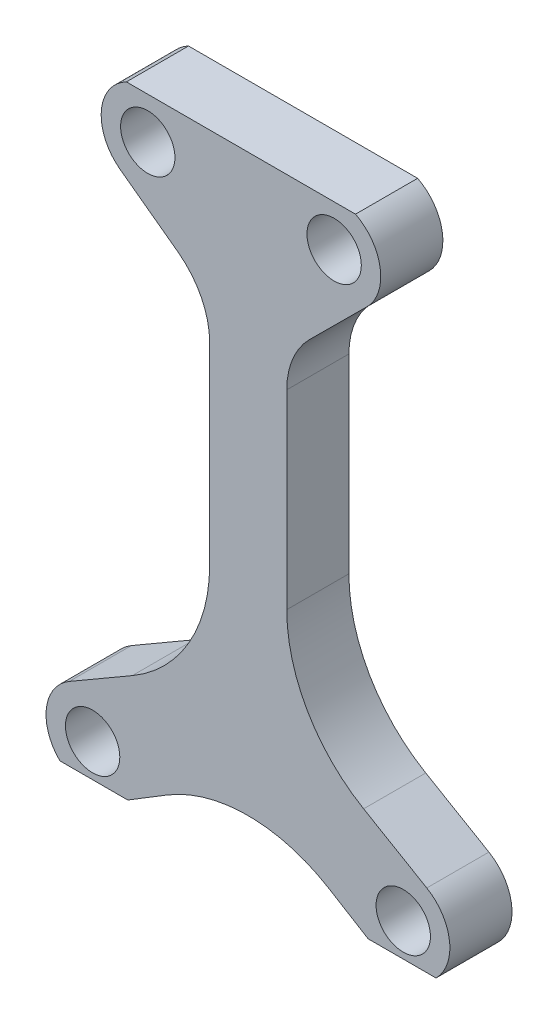
ISO-10303-21;
HEADER;
FILE_DESCRIPTION(('STEP AP214'),'2;1');
FILE_NAME('part.step','',(''),(''),'','','');
FILE_SCHEMA(('AUTOMOTIVE_DESIGN { 1 0 10303 214 1 1 1 1 }'));
ENDSEC;
DATA;
#1=APPLICATION_CONTEXT('core data for automotive mechanical design processes');
#2=APPLICATION_PROTOCOL_DEFINITION('international standard','automotive_design',2000,#1);
#3=PRODUCT_CONTEXT('',#1,'mechanical');
#4=PRODUCT('Part','Part','',(#3));
#5=PRODUCT_RELATED_PRODUCT_CATEGORY('part','',(#4));
#6=PRODUCT_DEFINITION_FORMATION('','',#4);
#7=PRODUCT_DEFINITION_CONTEXT('part definition',#1,'design');
#8=PRODUCT_DEFINITION('design','',#6,#7);
#9=PRODUCT_DEFINITION_SHAPE('','',#8);
#10=(LENGTH_UNIT() NAMED_UNIT(*) SI_UNIT(.MILLI.,.METRE.));
#11=(NAMED_UNIT(*) PLANE_ANGLE_UNIT() SI_UNIT($,.RADIAN.));
#12=(NAMED_UNIT(*) SI_UNIT($,.STERADIAN.) SOLID_ANGLE_UNIT());
#13=UNCERTAINTY_MEASURE_WITH_UNIT(LENGTH_MEASURE(1.E-05),#10,'distance_accuracy_value','');
#14=(GEOMETRIC_REPRESENTATION_CONTEXT(3) GLOBAL_UNCERTAINTY_ASSIGNED_CONTEXT((#13)) GLOBAL_UNIT_ASSIGNED_CONTEXT((#10,
#11,#12)) REPRESENTATION_CONTEXT('',''));
#15=CARTESIAN_POINT('',(0.,0.,0.));
#16=DIRECTION('',(0.,0.,1.));
#17=DIRECTION('',(1.,0.,0.));
#18=AXIS2_PLACEMENT_3D('',#15,#16,#17);
#19=CARTESIAN_POINT('',(0.,0.,4.));
#20=DIRECTION('',(0.,1.,0.));
#21=DIRECTION('',(0.,0.,1.));
#22=AXIS2_PLACEMENT_3D('',#19,#20,#21);
#23=PLANE('',#22);
#24=DIRECTION('',(0.,0.,1.));
#25=VECTOR('',#24,1.);
#26=CARTESIAN_POINT('',(26.1079954434977,0.,0.));
#27=LINE('',#26,#25);
#28=CARTESIAN_POINT('',(26.1079954434977,0.,4.));
#29=VERTEX_POINT('',#28);
#30=CARTESIAN_POINT('',(26.1079954434977,0.,0.));
#31=VERTEX_POINT('',#30);
#32=EDGE_CURVE('E363',#29,#31,#27,.F.);
#33=ORIENTED_EDGE('',*,*,#32,.F.);
#34=DIRECTION('',(1.,0.,0.));
#35=VECTOR('',#34,1.);
#36=CARTESIAN_POINT('',(0.,0.,4.));
#37=LINE('',#36,#35);
#38=CARTESIAN_POINT('',(21.7389056072508,0.,4.));
#39=VERTEX_POINT('',#38);
#40=EDGE_CURVE('E398',#39,#29,#37,.T.);
#41=ORIENTED_EDGE('',*,*,#40,.F.);
#42=DIRECTION('',(0.,0.,1.));
#43=VECTOR('',#42,1.);
#44=CARTESIAN_POINT('',(21.7389056072508,0.,4.));
#45=LINE('',#44,#43);
#46=CARTESIAN_POINT('',(21.7389056072508,0.,0.));
#47=VERTEX_POINT('',#46);
#48=EDGE_CURVE('E360',#47,#39,#45,.T.);
#49=ORIENTED_EDGE('',*,*,#48,.F.);
#50=DIRECTION('',(1.,0.,0.));
#51=VECTOR('',#50,1.);
#52=CARTESIAN_POINT('',(0.,0.,0.));
#53=LINE('',#52,#51);
#54=EDGE_CURVE('E370',#47,#31,#53,.T.);
#55=ORIENTED_EDGE('',*,*,#54,.T.);
#56=EDGE_LOOP('',(#33,#41,#49,#55));
#57=FACE_BOUND('',#56,.T.);
#58=ADVANCED_FACE('F38',(#57),#23,.F.);
#59=DIRECTION('',(0.,0.,-1.));
#60=VECTOR('',#59,1.);
#61=CARTESIAN_POINT('',(6.26109439275633,0.,4.));
#62=LINE('',#61,#60);
#63=CARTESIAN_POINT('',(6.26109439275633,0.,4.));
#64=VERTEX_POINT('',#63);
#65=CARTESIAN_POINT('',(6.26109439275633,0.,0.));
#66=VERTEX_POINT('',#65);
#67=EDGE_CURVE('E61',#64,#66,#62,.T.);
#68=ORIENTED_EDGE('',*,*,#67,.F.);
#69=CARTESIAN_POINT('',(1.89200455651023,0.,4.));
#70=VERTEX_POINT('',#69);
#71=EDGE_CURVE('E402',#70,#64,#37,.T.);
#72=ORIENTED_EDGE('',*,*,#71,.F.);
#73=DIRECTION('',(0.,0.,1.));
#74=VECTOR('',#73,1.);
#75=CARTESIAN_POINT('',(1.89200455651023,0.,0.));
#76=LINE('',#75,#74);
#77=CARTESIAN_POINT('',(1.89200455651023,0.,0.));
#78=VERTEX_POINT('',#77);
#79=EDGE_CURVE('E355',#78,#70,#76,.T.);
#80=ORIENTED_EDGE('',*,*,#79,.F.);
#81=EDGE_CURVE('E412',#78,#66,#53,.T.);
#82=ORIENTED_EDGE('',*,*,#81,.T.);
#83=EDGE_LOOP('',(#68,#72,#80,#82));
#84=FACE_BOUND('',#83,.T.);
#85=ADVANCED_FACE('F463',(#84),#23,.F.);
#86=CARTESIAN_POINT('',(0.,40.,4.));
#87=DIRECTION('',(0.,-1.,0.));
#88=DIRECTION('',(0.,0.,-1.));
#89=AXIS2_PLACEMENT_3D('',#86,#87,#88);
#90=PLANE('',#89);
#91=DIRECTION('',(0.,0.,1.));
#92=VECTOR('',#91,1.);
#93=CARTESIAN_POINT('',(6.17324998088211,40.,0.));
#94=LINE('',#93,#92);
#95=CARTESIAN_POINT('',(6.17324998088211,40.,4.));
#96=VERTEX_POINT('',#95);
#97=CARTESIAN_POINT('',(6.17324998088211,40.,0.));
#98=VERTEX_POINT('',#97);
#99=EDGE_CURVE('E352',#96,#98,#94,.F.);
#100=ORIENTED_EDGE('',*,*,#99,.F.);
#101=DIRECTION('',(-1.,0.,0.));
#102=VECTOR('',#101,1.);
#103=CARTESIAN_POINT('',(0.,40.,4.));
#104=LINE('',#103,#102);
#105=CARTESIAN_POINT('',(20.9267500191273,40.,4.));
#106=VERTEX_POINT('',#105);
#107=EDGE_CURVE('E404',#106,#96,#104,.T.);
#108=ORIENTED_EDGE('',*,*,#107,.F.);
#109=DIRECTION('',(0.,0.,1.));
#110=VECTOR('',#109,1.);
#111=CARTESIAN_POINT('',(20.9267500191273,40.,0.));
#112=LINE('',#111,#110);
#113=CARTESIAN_POINT('',(20.9267500191273,40.,0.));
#114=VERTEX_POINT('',#113);
#115=EDGE_CURVE('E316',#114,#106,#112,.T.);
#116=ORIENTED_EDGE('',*,*,#115,.F.);
#117=DIRECTION('',(-1.,0.,0.));
#118=VECTOR('',#117,1.);
#119=CARTESIAN_POINT('',(0.,40.,0.));
#120=LINE('',#119,#118);
#121=EDGE_CURVE('E403',#114,#98,#120,.T.);
#122=ORIENTED_EDGE('',*,*,#121,.T.);
#123=EDGE_LOOP('',(#100,#108,#116,#122));
#124=FACE_BOUND('',#123,.T.);
#125=ADVANCED_FACE('F428',(#124),#90,.F.);
#126=CARTESIAN_POINT('',(0.,0.,4.));
#127=DIRECTION('',(0.,0.,-1.));
#128=DIRECTION('',(-1.,0.,0.));
#129=AXIS2_PLACEMENT_3D('',#126,#127,#128);
#130=PLANE('',#129);
#131=CARTESIAN_POINT('',(24.0000000000039,2.13456206520436,4.));
#132=DIRECTION('',(0.,0.,1.));
#133=DIRECTION('',(1.,0.,0.));
#134=AXIS2_PLACEMENT_3D('',#131,#132,#133);
#135=CIRCLE('',#134,1.75);
#136=CARTESIAN_POINT('',(25.7500000000039,2.13456206520436,4.));
#137=VERTEX_POINT('',#136);
#138=EDGE_CURVE('E387',#137,#137,#135,.T.);
#139=ORIENTED_EDGE('',*,*,#138,.F.);
#140=EDGE_LOOP('',(#139));
#141=FACE_BOUND('',#140,.T.);
#142=CARTESIAN_POINT('',(7.55000000000471,37.3345620650921,4.));
#143=DIRECTION('',(0.,0.,1.));
#144=DIRECTION('',(1.,0.,0.));
#145=AXIS2_PLACEMENT_3D('',#142,#143,#144);
#146=CIRCLE('',#145,1.75);
#147=CARTESIAN_POINT('',(9.30000000000471,37.3345620650921,4.));
#148=VERTEX_POINT('',#147);
#149=EDGE_CURVE('E380',#148,#148,#146,.T.);
#150=ORIENTED_EDGE('',*,*,#149,.F.);
#151=EDGE_LOOP('',(#150));
#152=FACE_BOUND('',#151,.T.);
#153=CARTESIAN_POINT('',(19.5500000000047,37.3345620650921,4.));
#154=DIRECTION('',(0.,0.,1.));
#155=DIRECTION('',(1.,0.,0.));
#156=AXIS2_PLACEMENT_3D('',#153,#154,#155);
#157=CIRCLE('',#156,1.75);
#158=CARTESIAN_POINT('',(21.3000000000047,37.3345620650921,4.));
#159=VERTEX_POINT('',#158);
#160=EDGE_CURVE('E365',#159,#159,#157,.T.);
#161=ORIENTED_EDGE('',*,*,#160,.F.);
#162=EDGE_LOOP('',(#161));
#163=FACE_BOUND('',#162,.T.);
#164=CARTESIAN_POINT('',(4.00000000000394,2.13456206520442,4.));
#165=DIRECTION('',(0.,0.,1.));
#166=DIRECTION('',(1.,0.,0.));
#167=AXIS2_PLACEMENT_3D('',#164,#165,#166);
#168=CIRCLE('',#167,1.75);
#169=CARTESIAN_POINT('',(5.75000000000394,2.13456206520442,4.));
#170=VERTEX_POINT('',#169);
#171=EDGE_CURVE('E371',#170,#170,#168,.T.);
#172=ORIENTED_EDGE('',*,*,#171,.F.);
#173=EDGE_LOOP('',(#172));
#174=FACE_BOUND('',#173,.T.);
#175=DIRECTION('',(0.853556600559129,-0.521000124416438,0.));
#176=VECTOR('',#175,1.);
#177=CARTESIAN_POINT('',(19.2100012441668,1.54361115237226,4.));
#178=LINE('',#177,#176);
#179=CARTESIAN_POINT('',(19.2100012441668,1.54361115237226,4.));
#180=VERTEX_POINT('',#179);
#181=EDGE_CURVE('E309',#180,#39,#178,.T.);
#182=ORIENTED_EDGE('',*,*,#181,.T.);
#183=ORIENTED_EDGE('',*,*,#40,.T.);
#184=CARTESIAN_POINT('',(24.0000000000039,2.13456206520436,4.));
#185=DIRECTION('',(0.,0.,1.));
#186=DIRECTION('',(1.,0.,0.));
#187=AXIS2_PLACEMENT_3D('',#184,#185,#186);
#188=CIRCLE('',#187,3.);
#189=CARTESIAN_POINT('',(25.51532512477,4.72372984004107,4.));
#190=VERTEX_POINT('',#189);
#191=EDGE_CURVE('E248',#29,#190,#188,.T.);
#192=ORIENTED_EDGE('',*,*,#191,.T.);
#193=DIRECTION('',(-0.863055924945569,0.505108374922004,0.));
#194=VECTOR('',#193,1.);
#195=CARTESIAN_POINT('',(21.44891625078,7.1036186963038,4.));
#196=LINE('',#195,#194);
#197=CARTESIAN_POINT('',(21.44891625078,7.10361869630379,4.));
#198=VERTEX_POINT('',#197);
#199=EDGE_CURVE('E252',#190,#198,#196,.T.);
#200=ORIENTED_EDGE('',*,*,#199,.T.);
#201=CARTESIAN_POINT('',(26.5,15.7341779457595,4.));
#202=DIRECTION('',(0.,0.,-1.));
#203=DIRECTION('',(-1.,0.,0.));
#204=AXIS2_PLACEMENT_3D('',#201,#202,#203);
#205=CIRCLE('',#204,10.);
#206=CARTESIAN_POINT('',(16.5,15.7341779457596,4.));
#207=VERTEX_POINT('',#206);
#208=EDGE_CURVE('E256',#198,#207,#205,.T.);
#209=ORIENTED_EDGE('',*,*,#208,.T.);
#210=DIRECTION('',(0.,1.,0.));
#211=VECTOR('',#210,1.);
#212=CARTESIAN_POINT('',(16.5,27.9926692747528,4.));
#213=LINE('',#212,#211);
#214=CARTESIAN_POINT('',(16.5,27.9926692747528,4.));
#215=VERTEX_POINT('',#214);
#216=EDGE_CURVE('E182',#207,#215,#213,.T.);
#217=ORIENTED_EDGE('',*,*,#216,.T.);
#218=CARTESIAN_POINT('',(21.5,27.9926692747528,4.));
#219=DIRECTION('',(0.,0.,-1.));
#220=DIRECTION('',(1.,0.,0.));
#221=AXIS2_PLACEMENT_3D('',#218,#219,#220);
#222=CIRCLE('',#221,5.);
#223=CARTESIAN_POINT('',(17.9749396182113,31.5386457699856,4.));
#224=VERTEX_POINT('',#223);
#225=EDGE_CURVE('E261',#215,#224,#222,.T.);
#226=ORIENTED_EDGE('',*,*,#225,.T.);
#227=DIRECTION('',(0.709195299046571,0.705012076357735,0.));
#228=VECTOR('',#227,1.);
#229=CARTESIAN_POINT('',(17.9749396182113,31.5386457699856,4.));
#230=LINE('',#229,#228);
#231=CARTESIAN_POINT('',(21.6650362290779,35.2069761679524,4.));
#232=VERTEX_POINT('',#231);
#233=EDGE_CURVE('E265',#224,#232,#230,.T.);
#234=ORIENTED_EDGE('',*,*,#233,.T.);
#235=CARTESIAN_POINT('',(19.5500000000047,37.3345620650921,4.));
#236=DIRECTION('',(0.,0.,1.));
#237=DIRECTION('',(1.,0.,0.));
#238=AXIS2_PLACEMENT_3D('',#235,#236,#237);
#239=CIRCLE('',#238,3.);
#240=EDGE_CURVE('E269',#232,#106,#239,.T.);
#241=ORIENTED_EDGE('',*,*,#240,.T.);
#242=ORIENTED_EDGE('',*,*,#107,.T.);
#243=CARTESIAN_POINT('',(7.55000000000471,37.3345620650921,4.));
#244=DIRECTION('',(0.,0.,1.));
#245=DIRECTION('',(1.,0.,0.));
#246=AXIS2_PLACEMENT_3D('',#243,#244,#245);
#247=CIRCLE('',#246,3.);
#248=CARTESIAN_POINT('',(5.77076355040617,34.919128841751,4.));
#249=VERTEX_POINT('',#248);
#250=EDGE_CURVE('E273',#96,#249,#247,.T.);
#251=ORIENTED_EDGE('',*,*,#250,.T.);
#252=DIRECTION('',(0.805144407780368,-0.593078816532846,0.));
#253=VECTOR('',#252,1.);
#254=CARTESIAN_POINT('',(5.77076355040617,34.919128841751,4.));
#255=LINE('',#254,#253);
#256=CARTESIAN_POINT('',(9.50151194166027,32.1710158085045,4.));
#257=VERTEX_POINT('',#256);
#258=EDGE_CURVE('E277',#249,#257,#255,.T.);
#259=ORIENTED_EDGE('',*,*,#258,.T.);
#260=CARTESIAN_POINT('',(6.53611785899604,28.1452937696026,4.));
#261=DIRECTION('',(0.,0.,-1.));
#262=DIRECTION('',(1.,0.,0.));
#263=AXIS2_PLACEMENT_3D('',#260,#261,#262);
#264=CIRCLE('',#263,5.);
#265=CARTESIAN_POINT('',(11.536117858996,28.1452937696026,4.));
#266=VERTEX_POINT('',#265);
#267=EDGE_CURVE('E281',#257,#266,#264,.T.);
#268=ORIENTED_EDGE('',*,*,#267,.T.);
#269=DIRECTION('',(0.,-1.,0.));
#270=VECTOR('',#269,1.);
#271=CARTESIAN_POINT('',(11.536117858996,28.1452937696026,4.));
#272=LINE('',#271,#270);
#273=CARTESIAN_POINT('',(11.536117858996,15.7341925211431,4.));
#274=VERTEX_POINT('',#273);
#275=EDGE_CURVE('E285',#266,#274,#272,.T.);
#276=ORIENTED_EDGE('',*,*,#275,.T.);
#277=CARTESIAN_POINT('',(1.53611785899604,15.7341925211431,4.));
#278=DIRECTION('',(0.,0.,-1.));
#279=DIRECTION('',(-1.,0.,0.));
#280=AXIS2_PLACEMENT_3D('',#277,#278,#279);
#281=CIRCLE('',#280,10.);
#282=CARTESIAN_POINT('',(6.55381263069558,7.08417869583285,4.));
#283=VERTEX_POINT('',#282);
#284=EDGE_CURVE('E289',#274,#283,#281,.T.);
#285=ORIENTED_EDGE('',*,*,#284,.T.);
#286=DIRECTION('',(-0.865001382531029,-0.501769477169953,0.));
#287=VECTOR('',#286,1.);
#288=CARTESIAN_POINT('',(6.55381263069558,7.08417869583285,4.));
#289=LINE('',#288,#287);
#290=CARTESIAN_POINT('',(2.49469156849407,4.72956621279751,4.));
#291=VERTEX_POINT('',#290);
#292=EDGE_CURVE('E293',#283,#291,#289,.T.);
#293=ORIENTED_EDGE('',*,*,#292,.T.);
#294=CARTESIAN_POINT('',(4.00000000000394,2.13456206520442,4.));
#295=DIRECTION('',(0.,0.,1.));
#296=DIRECTION('',(1.,0.,0.));
#297=AXIS2_PLACEMENT_3D('',#294,#295,#296);
#298=CIRCLE('',#297,3.);
#299=EDGE_CURVE('E297',#291,#70,#298,.T.);
#300=ORIENTED_EDGE('',*,*,#299,.T.);
#301=ORIENTED_EDGE('',*,*,#71,.T.);
#302=DIRECTION('',(0.853556600558915,0.521000124416788,0.));
#303=VECTOR('',#302,1.);
#304=CARTESIAN_POINT('',(5.5630003732543,-0.426107736472325,4.));
#305=LINE('',#304,#303);
#306=CARTESIAN_POINT('',(8.78999875583448,1.54361115237013,4.));
#307=VERTEX_POINT('',#306);
#308=EDGE_CURVE('E301',#64,#307,#305,.T.);
#309=ORIENTED_EDGE('',*,*,#308,.T.);
#310=CARTESIAN_POINT('',(14.0000000000024,-6.991954853219,4.));
#311=DIRECTION('',(0.,0.,-1.));
#312=DIRECTION('',(-1.,0.,0.));
#313=AXIS2_PLACEMENT_3D('',#310,#311,#312);
#314=CIRCLE('',#313,10.);
#315=EDGE_CURVE('E305',#307,#180,#314,.T.);
#316=ORIENTED_EDGE('',*,*,#315,.T.);
#317=EDGE_LOOP('',(#182,#183,#192,#200,#209,#217,#226,#234,#241,#242,#251,#259,#268,#276,#285,
#293,#300,#301,#309,#316));
#318=FACE_BOUND('',#317,.T.);
#319=ADVANCED_FACE('F434',(#141,#152,#163,#174,#318),#130,.F.);
#320=CARTESIAN_POINT('',(0.,0.,0.));
#321=DIRECTION('',(0.,0.,-1.));
#322=DIRECTION('',(-1.,0.,0.));
#323=AXIS2_PLACEMENT_3D('',#320,#321,#322);
#324=PLANE('',#323);
#325=CARTESIAN_POINT('',(4.00000000000394,2.13456206520442,0.));
#326=DIRECTION('',(0.,0.,1.));
#327=DIRECTION('',(1.,0.,0.));
#328=AXIS2_PLACEMENT_3D('',#325,#326,#327);
#329=CIRCLE('',#328,1.75);
#330=CARTESIAN_POINT('',(5.75000000000394,2.13456206520442,0.));
#331=VERTEX_POINT('',#330);
#332=EDGE_CURVE('E366',#331,#331,#329,.T.);
#333=ORIENTED_EDGE('',*,*,#332,.T.);
#334=EDGE_LOOP('',(#333));
#335=FACE_BOUND('',#334,.T.);
#336=CARTESIAN_POINT('',(19.5500000000047,37.3345620650921,0.));
#337=DIRECTION('',(0.,0.,1.));
#338=DIRECTION('',(1.,0.,0.));
#339=AXIS2_PLACEMENT_3D('',#336,#337,#338);
#340=CIRCLE('',#339,1.75);
#341=CARTESIAN_POINT('',(21.3000000000047,37.3345620650921,0.));
#342=VERTEX_POINT('',#341);
#343=EDGE_CURVE('E376',#342,#342,#340,.T.);
#344=ORIENTED_EDGE('',*,*,#343,.T.);
#345=EDGE_LOOP('',(#344));
#346=FACE_BOUND('',#345,.T.);
#347=CARTESIAN_POINT('',(7.55000000000471,37.3345620650921,0.));
#348=DIRECTION('',(0.,0.,1.));
#349=DIRECTION('',(1.,0.,0.));
#350=AXIS2_PLACEMENT_3D('',#347,#348,#349);
#351=CIRCLE('',#350,1.75);
#352=CARTESIAN_POINT('',(9.30000000000471,37.3345620650921,0.));
#353=VERTEX_POINT('',#352);
#354=EDGE_CURVE('E391',#353,#353,#351,.T.);
#355=ORIENTED_EDGE('',*,*,#354,.T.);
#356=EDGE_LOOP('',(#355));
#357=FACE_BOUND('',#356,.T.);
#358=CARTESIAN_POINT('',(24.0000000000039,2.13456206520436,0.));
#359=DIRECTION('',(0.,0.,1.));
#360=DIRECTION('',(1.,0.,0.));
#361=AXIS2_PLACEMENT_3D('',#358,#359,#360);
#362=CIRCLE('',#361,1.75);
#363=CARTESIAN_POINT('',(25.7500000000039,2.13456206520436,0.));
#364=VERTEX_POINT('',#363);
#365=EDGE_CURVE('E375',#364,#364,#362,.T.);
#366=ORIENTED_EDGE('',*,*,#365,.T.);
#367=EDGE_LOOP('',(#366));
#368=FACE_BOUND('',#367,.T.);
#369=ORIENTED_EDGE('',*,*,#54,.F.);
#370=DIRECTION('',(0.853556600559129,-0.521000124416438,0.));
#371=VECTOR('',#370,1.);
#372=CARTESIAN_POINT('',(19.2100012441668,1.54361115237226,0.));
#373=LINE('',#372,#371);
#374=CARTESIAN_POINT('',(19.2100012441668,1.54361115237226,0.));
#375=VERTEX_POINT('',#374);
#376=EDGE_CURVE('E245',#375,#47,#373,.T.);
#377=ORIENTED_EDGE('',*,*,#376,.F.);
#378=CARTESIAN_POINT('',(14.0000000000024,-6.991954853219,0.));
#379=DIRECTION('',(0.,0.,-1.));
#380=DIRECTION('',(-1.,0.,0.));
#381=AXIS2_PLACEMENT_3D('',#378,#379,#380);
#382=CIRCLE('',#381,10.);
#383=CARTESIAN_POINT('',(8.78999875583448,1.54361115237013,0.));
#384=VERTEX_POINT('',#383);
#385=EDGE_CURVE('E241',#384,#375,#382,.T.);
#386=ORIENTED_EDGE('',*,*,#385,.F.);
#387=DIRECTION('',(-0.853556600558915,-0.521000124416788,0.));
#388=VECTOR('',#387,1.);
#389=CARTESIAN_POINT('',(1.6995185347669,-2.78432805509664,0.));
#390=LINE('',#389,#388);
#391=EDGE_CURVE('E11',#384,#66,#390,.T.);
#392=ORIENTED_EDGE('',*,*,#391,.T.);
#393=ORIENTED_EDGE('',*,*,#81,.F.);
#394=CARTESIAN_POINT('',(4.00000000000394,2.13456206520442,0.));
#395=DIRECTION('',(0.,0.,1.));
#396=DIRECTION('',(1.,0.,0.));
#397=AXIS2_PLACEMENT_3D('',#394,#395,#396);
#398=CIRCLE('',#397,3.);
#399=CARTESIAN_POINT('',(2.49469156849407,4.72956621279751,0.));
#400=VERTEX_POINT('',#399);
#401=EDGE_CURVE('E238',#400,#78,#398,.T.);
#402=ORIENTED_EDGE('',*,*,#401,.F.);
#403=DIRECTION('',(-0.865001382531029,-0.501769477169953,0.));
#404=VECTOR('',#403,1.);
#405=CARTESIAN_POINT('',(6.55381263069558,7.08417869583285,0.));
#406=LINE('',#405,#404);
#407=CARTESIAN_POINT('',(6.55381263069558,7.08417869583285,0.));
#408=VERTEX_POINT('',#407);
#409=EDGE_CURVE('E234',#408,#400,#406,.T.);
#410=ORIENTED_EDGE('',*,*,#409,.F.);
#411=CARTESIAN_POINT('',(1.53611785899604,15.7341925211431,0.));
#412=DIRECTION('',(0.,0.,-1.));
#413=DIRECTION('',(-1.,0.,0.));
#414=AXIS2_PLACEMENT_3D('',#411,#412,#413);
#415=CIRCLE('',#414,10.);
#416=CARTESIAN_POINT('',(11.536117858996,15.7341925211431,0.));
#417=VERTEX_POINT('',#416);
#418=EDGE_CURVE('E230',#417,#408,#415,.T.);
#419=ORIENTED_EDGE('',*,*,#418,.F.);
#420=DIRECTION('',(0.,-1.,0.));
#421=VECTOR('',#420,1.);
#422=CARTESIAN_POINT('',(11.536117858996,28.1452937696026,0.));
#423=LINE('',#422,#421);
#424=CARTESIAN_POINT('',(11.536117858996,28.1452937696026,0.));
#425=VERTEX_POINT('',#424);
#426=EDGE_CURVE('E226',#425,#417,#423,.T.);
#427=ORIENTED_EDGE('',*,*,#426,.F.);
#428=CARTESIAN_POINT('',(6.53611785899604,28.1452937696026,0.));
#429=DIRECTION('',(0.,0.,-1.));
#430=DIRECTION('',(1.,0.,0.));
#431=AXIS2_PLACEMENT_3D('',#428,#429,#430);
#432=CIRCLE('',#431,5.);
#433=CARTESIAN_POINT('',(9.50151194166027,32.1710158085045,0.));
#434=VERTEX_POINT('',#433);
#435=EDGE_CURVE('E222',#434,#425,#432,.T.);
#436=ORIENTED_EDGE('',*,*,#435,.F.);
#437=DIRECTION('',(0.805144407780368,-0.593078816532846,0.));
#438=VECTOR('',#437,1.);
#439=CARTESIAN_POINT('',(5.77076355040617,34.919128841751,0.));
#440=LINE('',#439,#438);
#441=CARTESIAN_POINT('',(5.77076355040617,34.919128841751,0.));
#442=VERTEX_POINT('',#441);
#443=EDGE_CURVE('E218',#442,#434,#440,.T.);
#444=ORIENTED_EDGE('',*,*,#443,.F.);
#445=CARTESIAN_POINT('',(7.55000000000471,37.3345620650921,0.));
#446=DIRECTION('',(0.,0.,-1.));
#447=DIRECTION('',(-1.,0.,0.));
#448=AXIS2_PLACEMENT_3D('',#445,#446,#447);
#449=CIRCLE('',#448,3.);
#450=EDGE_CURVE('E46',#442,#98,#449,.T.);
#451=ORIENTED_EDGE('',*,*,#450,.T.);
#452=ORIENTED_EDGE('',*,*,#121,.F.);
#453=CARTESIAN_POINT('',(19.5500000000047,37.3345620650921,0.));
#454=DIRECTION('',(0.,0.,1.));
#455=DIRECTION('',(1.,0.,0.));
#456=AXIS2_PLACEMENT_3D('',#453,#454,#455);
#457=CIRCLE('',#456,3.);
#458=CARTESIAN_POINT('',(21.6650362290779,35.2069761679524,0.));
#459=VERTEX_POINT('',#458);
#460=EDGE_CURVE('E215',#459,#114,#457,.T.);
#461=ORIENTED_EDGE('',*,*,#460,.F.);
#462=DIRECTION('',(0.709195299046571,0.705012076357735,0.));
#463=VECTOR('',#462,1.);
#464=CARTESIAN_POINT('',(17.9749396182113,31.5386457699856,0.));
#465=LINE('',#464,#463);
#466=CARTESIAN_POINT('',(17.9749396182113,31.5386457699856,0.));
#467=VERTEX_POINT('',#466);
#468=EDGE_CURVE('E208',#467,#459,#465,.T.);
#469=ORIENTED_EDGE('',*,*,#468,.F.);
#470=CARTESIAN_POINT('',(21.5,27.9926692747528,0.));
#471=DIRECTION('',(0.,0.,-1.));
#472=DIRECTION('',(1.,0.,0.));
#473=AXIS2_PLACEMENT_3D('',#470,#471,#472);
#474=CIRCLE('',#473,5.);
#475=CARTESIAN_POINT('',(16.5,27.9926692747528,0.));
#476=VERTEX_POINT('',#475);
#477=EDGE_CURVE('E202',#476,#467,#474,.T.);
#478=ORIENTED_EDGE('',*,*,#477,.F.);
#479=DIRECTION('',(0.,1.,0.));
#480=VECTOR('',#479,1.);
#481=CARTESIAN_POINT('',(16.5,27.9926692747528,0.));
#482=LINE('',#481,#480);
#483=CARTESIAN_POINT('',(16.5,15.7341779457596,0.));
#484=VERTEX_POINT('',#483);
#485=EDGE_CURVE('E179',#484,#476,#482,.T.);
#486=ORIENTED_EDGE('',*,*,#485,.F.);
#487=CARTESIAN_POINT('',(26.5,15.7341779457595,0.));
#488=DIRECTION('',(0.,0.,-1.));
#489=DIRECTION('',(-1.,0.,0.));
#490=AXIS2_PLACEMENT_3D('',#487,#488,#489);
#491=CIRCLE('',#490,10.);
#492=CARTESIAN_POINT('',(21.44891625078,7.1036186963038,0.));
#493=VERTEX_POINT('',#492);
#494=EDGE_CURVE('E191',#493,#484,#491,.T.);
#495=ORIENTED_EDGE('',*,*,#494,.F.);
#496=DIRECTION('',(-0.863055924945569,0.505108374922004,0.));
#497=VECTOR('',#496,1.);
#498=CARTESIAN_POINT('',(21.44891625078,7.1036186963038,0.));
#499=LINE('',#498,#497);
#500=CARTESIAN_POINT('',(25.51532512477,4.72372984004107,0.));
#501=VERTEX_POINT('',#500);
#502=EDGE_CURVE('E196',#501,#493,#499,.T.);
#503=ORIENTED_EDGE('',*,*,#502,.F.);
#504=CARTESIAN_POINT('',(24.0000000000039,2.13456206520436,0.));
#505=DIRECTION('',(0.,0.,-1.));
#506=DIRECTION('',(-1.,0.,0.));
#507=AXIS2_PLACEMENT_3D('',#504,#505,#506);
#508=CIRCLE('',#507,3.);
#509=EDGE_CURVE('E408',#501,#31,#508,.T.);
#510=ORIENTED_EDGE('',*,*,#509,.T.);
#511=EDGE_LOOP('',(#369,#377,#386,#392,#393,#402,#410,#419,#427,#436,#444,#451,#452,#461,#469,
#478,#486,#495,#503,#510));
#512=FACE_BOUND('',#511,.T.);
#513=ADVANCED_FACE('F199',(#335,#346,#357,#368,#512),#324,.T.);
#514=CARTESIAN_POINT('',(24.0000000000039,2.13456206520436,0.));
#515=DIRECTION('',(0.,0.,1.));
#516=DIRECTION('',(1.,0.,0.));
#517=AXIS2_PLACEMENT_3D('',#514,#515,#516);
#518=CYLINDRICAL_SURFACE('',#517,1.75);
#519=ORIENTED_EDGE('',*,*,#365,.F.);
#520=EDGE_LOOP('',(#519));
#521=FACE_BOUND('',#520,.T.);
#522=ORIENTED_EDGE('',*,*,#138,.T.);
#523=EDGE_LOOP('',(#522));
#524=FACE_BOUND('',#523,.T.);
#525=ADVANCED_FACE('F513',(#521,#524),#518,.F.);
#526=CARTESIAN_POINT('',(7.55000000000471,37.3345620650921,0.));
#527=DIRECTION('',(0.,0.,1.));
#528=DIRECTION('',(1.,0.,0.));
#529=AXIS2_PLACEMENT_3D('',#526,#527,#528);
#530=CYLINDRICAL_SURFACE('',#529,1.75);
#531=ORIENTED_EDGE('',*,*,#354,.F.);
#532=EDGE_LOOP('',(#531));
#533=FACE_BOUND('',#532,.T.);
#534=ORIENTED_EDGE('',*,*,#149,.T.);
#535=EDGE_LOOP('',(#534));
#536=FACE_BOUND('',#535,.T.);
#537=ADVANCED_FACE('F516',(#533,#536),#530,.F.);
#538=CARTESIAN_POINT('',(19.5500000000047,37.3345620650921,0.));
#539=DIRECTION('',(0.,0.,1.));
#540=DIRECTION('',(1.,0.,0.));
#541=AXIS2_PLACEMENT_3D('',#538,#539,#540);
#542=CYLINDRICAL_SURFACE('',#541,1.75);
#543=ORIENTED_EDGE('',*,*,#343,.F.);
#544=EDGE_LOOP('',(#543));
#545=FACE_BOUND('',#544,.T.);
#546=ORIENTED_EDGE('',*,*,#160,.T.);
#547=EDGE_LOOP('',(#546));
#548=FACE_BOUND('',#547,.T.);
#549=ADVANCED_FACE('F519',(#545,#548),#542,.F.);
#550=CARTESIAN_POINT('',(4.00000000000394,2.13456206520442,0.));
#551=DIRECTION('',(0.,0.,1.));
#552=DIRECTION('',(1.,0.,0.));
#553=AXIS2_PLACEMENT_3D('',#550,#551,#552);
#554=CYLINDRICAL_SURFACE('',#553,1.75);
#555=ORIENTED_EDGE('',*,*,#332,.F.);
#556=EDGE_LOOP('',(#555));
#557=FACE_BOUND('',#556,.T.);
#558=ORIENTED_EDGE('',*,*,#171,.T.);
#559=EDGE_LOOP('',(#558));
#560=FACE_BOUND('',#559,.T.);
#561=ADVANCED_FACE('F526',(#557,#560),#554,.F.);
#562=CARTESIAN_POINT('',(21.44891625078,7.1036186963038,0.));
#563=DIRECTION('',(0.505108374922004,0.863055924945569,0.));
#564=DIRECTION('',(-0.863055924945569,0.505108374922004,0.));
#565=AXIS2_PLACEMENT_3D('',#562,#563,#564);
#566=PLANE('',#565);
#567=ORIENTED_EDGE('',*,*,#199,.F.);
#568=DIRECTION('',(0.,0.,1.));
#569=VECTOR('',#568,1.);
#570=CARTESIAN_POINT('',(25.51532512477,4.72372984004107,0.));
#571=LINE('',#570,#569);
#572=EDGE_CURVE('E53',#501,#190,#571,.T.);
#573=ORIENTED_EDGE('',*,*,#572,.F.);
#574=ORIENTED_EDGE('',*,*,#502,.T.);
#575=DIRECTION('',(0.,0.,1.));
#576=VECTOR('',#575,1.);
#577=CARTESIAN_POINT('',(21.44891625078,7.10361869630379,0.));
#578=LINE('',#577,#576);
#579=EDGE_CURVE('E188',#493,#198,#578,.T.);
#580=ORIENTED_EDGE('',*,*,#579,.T.);
#581=EDGE_LOOP('',(#567,#573,#574,#580));
#582=FACE_BOUND('',#581,.T.);
#583=ADVANCED_FACE('F441',(#582),#566,.T.);
#584=CARTESIAN_POINT('',(26.5,15.7341779457595,0.));
#585=DIRECTION('',(0.,0.,1.));
#586=DIRECTION('',(1.,0.,0.));
#587=AXIS2_PLACEMENT_3D('',#584,#585,#586);
#588=CYLINDRICAL_SURFACE('',#587,10.);
#589=ORIENTED_EDGE('',*,*,#208,.F.);
#590=ORIENTED_EDGE('',*,*,#579,.F.);
#591=ORIENTED_EDGE('',*,*,#494,.T.);
#592=DIRECTION('',(0.,0.,1.));
#593=VECTOR('',#592,1.);
#594=CARTESIAN_POINT('',(16.5,15.7341779457596,0.));
#595=LINE('',#594,#593);
#596=EDGE_CURVE('E175',#484,#207,#595,.T.);
#597=ORIENTED_EDGE('',*,*,#596,.T.);
#598=EDGE_LOOP('',(#589,#590,#591,#597));
#599=FACE_BOUND('',#598,.T.);
#600=ADVANCED_FACE('F192',(#599),#588,.F.);
#601=CARTESIAN_POINT('',(16.5,27.9926692747528,0.));
#602=DIRECTION('',(1.,0.,0.));
#603=DIRECTION('',(0.,1.,0.));
#604=AXIS2_PLACEMENT_3D('',#601,#602,#603);
#605=PLANE('',#604);
#606=ORIENTED_EDGE('',*,*,#216,.F.);
#607=ORIENTED_EDGE('',*,*,#596,.F.);
#608=ORIENTED_EDGE('',*,*,#485,.T.);
#609=DIRECTION('',(0.,0.,1.));
#610=VECTOR('',#609,1.);
#611=CARTESIAN_POINT('',(16.5,27.9926692747528,0.));
#612=LINE('',#611,#610);
#613=EDGE_CURVE('E187',#476,#215,#612,.T.);
#614=ORIENTED_EDGE('',*,*,#613,.T.);
#615=EDGE_LOOP('',(#606,#607,#608,#614));
#616=FACE_BOUND('',#615,.T.);
#617=ADVANCED_FACE('F177',(#616),#605,.T.);
#618=CARTESIAN_POINT('',(21.5,27.9926692747528,0.));
#619=DIRECTION('',(0.,0.,1.));
#620=DIRECTION('',(1.,0.,0.));
#621=AXIS2_PLACEMENT_3D('',#618,#619,#620);
#622=CYLINDRICAL_SURFACE('',#621,5.);
#623=ORIENTED_EDGE('',*,*,#225,.F.);
#624=ORIENTED_EDGE('',*,*,#613,.F.);
#625=ORIENTED_EDGE('',*,*,#477,.T.);
#626=DIRECTION('',(0.,0.,1.));
#627=VECTOR('',#626,1.);
#628=CARTESIAN_POINT('',(17.9749396182113,31.5386457699856,0.));
#629=LINE('',#628,#627);
#630=EDGE_CURVE('E341',#467,#224,#629,.T.);
#631=ORIENTED_EDGE('',*,*,#630,.T.);
#632=EDGE_LOOP('',(#623,#624,#625,#631));
#633=FACE_BOUND('',#632,.T.);
#634=ADVANCED_FACE('F440',(#633),#622,.F.);
#635=CARTESIAN_POINT('',(17.9749396182113,31.5386457699856,0.));
#636=DIRECTION('',(0.705012076357735,-0.709195299046571,0.));
#637=DIRECTION('',(0.709195299046571,0.705012076357735,0.));
#638=AXIS2_PLACEMENT_3D('',#635,#636,#637);
#639=PLANE('',#638);
#640=ORIENTED_EDGE('',*,*,#233,.F.);
#641=ORIENTED_EDGE('',*,*,#630,.F.);
#642=ORIENTED_EDGE('',*,*,#468,.T.);
#643=DIRECTION('',(0.,0.,1.));
#644=VECTOR('',#643,1.);
#645=CARTESIAN_POINT('',(21.6650362290779,35.2069761679524,0.));
#646=LINE('',#645,#644);
#647=EDGE_CURVE('E338',#459,#232,#646,.T.);
#648=ORIENTED_EDGE('',*,*,#647,.T.);
#649=EDGE_LOOP('',(#640,#641,#642,#648));
#650=FACE_BOUND('',#649,.T.);
#651=ADVANCED_FACE('F438',(#650),#639,.T.);
#652=CARTESIAN_POINT('',(19.5500000000047,37.3345620650921,0.));
#653=DIRECTION('',(0.,0.,1.));
#654=DIRECTION('',(1.,0.,0.));
#655=AXIS2_PLACEMENT_3D('',#652,#653,#654);
#656=CYLINDRICAL_SURFACE('',#655,3.);
#657=ORIENTED_EDGE('',*,*,#115,.T.);
#658=ORIENTED_EDGE('',*,*,#240,.F.);
#659=ORIENTED_EDGE('',*,*,#647,.F.);
#660=ORIENTED_EDGE('',*,*,#460,.T.);
#661=EDGE_LOOP('',(#657,#658,#659,#660));
#662=FACE_BOUND('',#661,.T.);
#663=ADVANCED_FACE('F432',(#662),#656,.T.);
#664=CARTESIAN_POINT('',(24.0000000000039,2.13456206520436,0.));
#665=DIRECTION('',(0.,0.,1.));
#666=DIRECTION('',(1.,0.,0.));
#667=AXIS2_PLACEMENT_3D('',#664,#665,#666);
#668=CYLINDRICAL_SURFACE('',#667,3.);
#669=ORIENTED_EDGE('',*,*,#32,.T.);
#670=ORIENTED_EDGE('',*,*,#509,.F.);
#671=ORIENTED_EDGE('',*,*,#572,.T.);
#672=ORIENTED_EDGE('',*,*,#191,.F.);
#673=EDGE_LOOP('',(#669,#670,#671,#672));
#674=FACE_BOUND('',#673,.T.);
#675=ADVANCED_FACE('F490',(#674),#668,.T.);
#676=CARTESIAN_POINT('',(7.55000000000471,37.3345620650921,0.));
#677=DIRECTION('',(0.,0.,1.));
#678=DIRECTION('',(1.,0.,0.));
#679=AXIS2_PLACEMENT_3D('',#676,#677,#678);
#680=CYLINDRICAL_SURFACE('',#679,3.);
#681=ORIENTED_EDGE('',*,*,#99,.T.);
#682=ORIENTED_EDGE('',*,*,#450,.F.);
#683=DIRECTION('',(0.,0.,1.));
#684=VECTOR('',#683,1.);
#685=CARTESIAN_POINT('',(5.77076355040617,34.919128841751,0.));
#686=LINE('',#685,#684);
#687=EDGE_CURVE('E335',#442,#249,#686,.T.);
#688=ORIENTED_EDGE('',*,*,#687,.T.);
#689=ORIENTED_EDGE('',*,*,#250,.F.);
#690=EDGE_LOOP('',(#681,#682,#688,#689));
#691=FACE_BOUND('',#690,.T.);
#692=ADVANCED_FACE('F488',(#691),#680,.T.);
#693=CARTESIAN_POINT('',(5.77076355040617,34.919128841751,0.));
#694=DIRECTION('',(-0.593078816532846,-0.805144407780368,0.));
#695=DIRECTION('',(0.805144407780368,-0.593078816532846,0.));
#696=AXIS2_PLACEMENT_3D('',#693,#694,#695);
#697=PLANE('',#696);
#698=ORIENTED_EDGE('',*,*,#258,.F.);
#699=ORIENTED_EDGE('',*,*,#687,.F.);
#700=ORIENTED_EDGE('',*,*,#443,.T.);
#701=DIRECTION('',(0.,0.,1.));
#702=VECTOR('',#701,1.);
#703=CARTESIAN_POINT('',(9.50151194166027,32.1710158085045,0.));
#704=LINE('',#703,#702);
#705=EDGE_CURVE('E332',#434,#257,#704,.T.);
#706=ORIENTED_EDGE('',*,*,#705,.T.);
#707=EDGE_LOOP('',(#698,#699,#700,#706));
#708=FACE_BOUND('',#707,.T.);
#709=ADVANCED_FACE('F487',(#708),#697,.T.);
#710=CARTESIAN_POINT('',(6.53611785899604,28.1452937696026,0.));
#711=DIRECTION('',(0.,0.,1.));
#712=DIRECTION('',(1.,0.,0.));
#713=AXIS2_PLACEMENT_3D('',#710,#711,#712);
#714=CYLINDRICAL_SURFACE('',#713,5.);
#715=ORIENTED_EDGE('',*,*,#267,.F.);
#716=ORIENTED_EDGE('',*,*,#705,.F.);
#717=ORIENTED_EDGE('',*,*,#435,.T.);
#718=DIRECTION('',(0.,0.,1.));
#719=VECTOR('',#718,1.);
#720=CARTESIAN_POINT('',(11.536117858996,28.1452937696026,0.));
#721=LINE('',#720,#719);
#722=EDGE_CURVE('E329',#425,#266,#721,.T.);
#723=ORIENTED_EDGE('',*,*,#722,.T.);
#724=EDGE_LOOP('',(#715,#716,#717,#723));
#725=FACE_BOUND('',#724,.T.);
#726=ADVANCED_FACE('F484',(#725),#714,.F.);
#727=CARTESIAN_POINT('',(11.536117858996,28.1452937696026,0.));
#728=DIRECTION('',(-1.,0.,0.));
#729=DIRECTION('',(0.,0.,1.));
#730=AXIS2_PLACEMENT_3D('',#727,#728,#729);
#731=PLANE('',#730);
#732=ORIENTED_EDGE('',*,*,#275,.F.);
#733=ORIENTED_EDGE('',*,*,#722,.F.);
#734=ORIENTED_EDGE('',*,*,#426,.T.);
#735=DIRECTION('',(0.,0.,1.));
#736=VECTOR('',#735,1.);
#737=CARTESIAN_POINT('',(11.536117858996,15.7341925211431,0.));
#738=LINE('',#737,#736);
#739=EDGE_CURVE('E326',#417,#274,#738,.T.);
#740=ORIENTED_EDGE('',*,*,#739,.T.);
#741=EDGE_LOOP('',(#732,#733,#734,#740));
#742=FACE_BOUND('',#741,.T.);
#743=ADVANCED_FACE('F481',(#742),#731,.T.);
#744=CARTESIAN_POINT('',(1.53611785899604,15.7341925211431,0.));
#745=DIRECTION('',(0.,0.,1.));
#746=DIRECTION('',(1.,0.,0.));
#747=AXIS2_PLACEMENT_3D('',#744,#745,#746);
#748=CYLINDRICAL_SURFACE('',#747,10.);
#749=ORIENTED_EDGE('',*,*,#284,.F.);
#750=ORIENTED_EDGE('',*,*,#739,.F.);
#751=ORIENTED_EDGE('',*,*,#418,.T.);
#752=DIRECTION('',(0.,0.,1.));
#753=VECTOR('',#752,1.);
#754=CARTESIAN_POINT('',(6.55381263069558,7.08417869583285,0.));
#755=LINE('',#754,#753);
#756=EDGE_CURVE('E323',#408,#283,#755,.T.);
#757=ORIENTED_EDGE('',*,*,#756,.T.);
#758=EDGE_LOOP('',(#749,#750,#751,#757));
#759=FACE_BOUND('',#758,.T.);
#760=ADVANCED_FACE('F478',(#759),#748,.F.);
#761=CARTESIAN_POINT('',(6.55381263069558,7.08417869583285,0.));
#762=DIRECTION('',(-0.501769477169953,0.865001382531029,0.));
#763=DIRECTION('',(-0.865001382531029,-0.501769477169953,0.));
#764=AXIS2_PLACEMENT_3D('',#761,#762,#763);
#765=PLANE('',#764);
#766=ORIENTED_EDGE('',*,*,#292,.F.);
#767=ORIENTED_EDGE('',*,*,#756,.F.);
#768=ORIENTED_EDGE('',*,*,#409,.T.);
#769=DIRECTION('',(0.,0.,1.));
#770=VECTOR('',#769,1.);
#771=CARTESIAN_POINT('',(2.49469156849407,4.72956621279751,0.));
#772=LINE('',#771,#770);
#773=EDGE_CURVE('E320',#400,#291,#772,.T.);
#774=ORIENTED_EDGE('',*,*,#773,.T.);
#775=EDGE_LOOP('',(#766,#767,#768,#774));
#776=FACE_BOUND('',#775,.T.);
#777=ADVANCED_FACE('F475',(#776),#765,.T.);
#778=CARTESIAN_POINT('',(4.00000000000394,2.13456206520442,0.));
#779=DIRECTION('',(0.,0.,1.));
#780=DIRECTION('',(1.,0.,0.));
#781=AXIS2_PLACEMENT_3D('',#778,#779,#780);
#782=CYLINDRICAL_SURFACE('',#781,3.);
#783=ORIENTED_EDGE('',*,*,#79,.T.);
#784=ORIENTED_EDGE('',*,*,#299,.F.);
#785=ORIENTED_EDGE('',*,*,#773,.F.);
#786=ORIENTED_EDGE('',*,*,#401,.T.);
#787=EDGE_LOOP('',(#783,#784,#785,#786));
#788=FACE_BOUND('',#787,.T.);
#789=ADVANCED_FACE('F470',(#788),#782,.T.);
#790=CARTESIAN_POINT('',(19.2100012441668,1.54361115237226,0.));
#791=DIRECTION('',(-0.521000124416438,-0.853556600559129,0.));
#792=DIRECTION('',(0.853556600559129,-0.521000124416438,0.));
#793=AXIS2_PLACEMENT_3D('',#790,#791,#792);
#794=PLANE('',#793);
#795=ORIENTED_EDGE('',*,*,#48,.T.);
#796=ORIENTED_EDGE('',*,*,#181,.F.);
#797=DIRECTION('',(0.,0.,1.));
#798=VECTOR('',#797,1.);
#799=CARTESIAN_POINT('',(19.2100012441668,1.54361115237226,0.));
#800=LINE('',#799,#798);
#801=EDGE_CURVE('E313',#375,#180,#800,.T.);
#802=ORIENTED_EDGE('',*,*,#801,.F.);
#803=ORIENTED_EDGE('',*,*,#376,.T.);
#804=EDGE_LOOP('',(#795,#796,#802,#803));
#805=FACE_BOUND('',#804,.T.);
#806=ADVANCED_FACE('F451',(#805),#794,.T.);
#807=CARTESIAN_POINT('',(5.5630003732543,-0.426107736472325,0.));
#808=DIRECTION('',(0.521000124416788,-0.853556600558915,0.));
#809=DIRECTION('',(0.853556600558915,0.521000124416788,0.));
#810=AXIS2_PLACEMENT_3D('',#807,#808,#809);
#811=PLANE('',#810);
#812=ORIENTED_EDGE('',*,*,#67,.T.);
#813=ORIENTED_EDGE('',*,*,#391,.F.);
#814=DIRECTION('',(0.,0.,1.));
#815=VECTOR('',#814,1.);
#816=CARTESIAN_POINT('',(8.78999875583448,1.54361115237013,0.));
#817=LINE('',#816,#815);
#818=EDGE_CURVE('E317',#384,#307,#817,.T.);
#819=ORIENTED_EDGE('',*,*,#818,.T.);
#820=ORIENTED_EDGE('',*,*,#308,.F.);
#821=EDGE_LOOP('',(#812,#813,#819,#820));
#822=FACE_BOUND('',#821,.T.);
#823=ADVANCED_FACE('F598',(#822),#811,.T.);
#824=CARTESIAN_POINT('',(14.0000000000024,-6.991954853219,0.));
#825=DIRECTION('',(0.,0.,1.));
#826=DIRECTION('',(1.,0.,0.));
#827=AXIS2_PLACEMENT_3D('',#824,#825,#826);
#828=CYLINDRICAL_SURFACE('',#827,10.);
#829=ORIENTED_EDGE('',*,*,#315,.F.);
#830=ORIENTED_EDGE('',*,*,#818,.F.);
#831=ORIENTED_EDGE('',*,*,#385,.T.);
#832=ORIENTED_EDGE('',*,*,#801,.T.);
#833=EDGE_LOOP('',(#829,#830,#831,#832));
#834=FACE_BOUND('',#833,.T.);
#835=ADVANCED_FACE('F456',(#834),#828,.F.);
#836=CLOSED_SHELL('',(#58,#85,#125,#319,#513,#525,#537,#549,#561,#583,#600,#617,#634,#651,#663,
#675,#692,#709,#726,#743,#760,#777,#789,#806,#823,#835));
#837=MANIFOLD_SOLID_BREP('B2',#836);
#838=ADVANCED_BREP_SHAPE_REPRESENTATION('',(#18,#837),#14);
#839=SHAPE_DEFINITION_REPRESENTATION(#9,#838);
ENDSEC;
END-ISO-10303-21;
